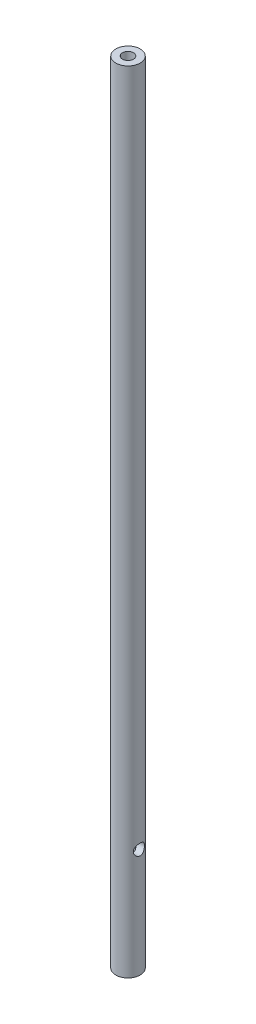
ISO-10303-21;
HEADER;
FILE_DESCRIPTION(('STEP AP214'),'2;1');
FILE_NAME('part.step','',(''),(''),'','','');
FILE_SCHEMA(('AUTOMOTIVE_DESIGN { 1 0 10303 214 1 1 1 1 }'));
ENDSEC;
DATA;
#1=APPLICATION_CONTEXT('core data for automotive mechanical design processes');
#2=APPLICATION_PROTOCOL_DEFINITION('international standard','automotive_design',2000,#1);
#3=PRODUCT_CONTEXT('',#1,'mechanical');
#4=PRODUCT('Part','Part','',(#3));
#5=PRODUCT_RELATED_PRODUCT_CATEGORY('part','',(#4));
#6=PRODUCT_DEFINITION_FORMATION('','',#4);
#7=PRODUCT_DEFINITION_CONTEXT('part definition',#1,'design');
#8=PRODUCT_DEFINITION('design','',#6,#7);
#9=PRODUCT_DEFINITION_SHAPE('','',#8);
#10=(LENGTH_UNIT() NAMED_UNIT(*) SI_UNIT(.MILLI.,.METRE.));
#11=(NAMED_UNIT(*) PLANE_ANGLE_UNIT() SI_UNIT($,.RADIAN.));
#12=(NAMED_UNIT(*) SI_UNIT($,.STERADIAN.) SOLID_ANGLE_UNIT());
#13=UNCERTAINTY_MEASURE_WITH_UNIT(LENGTH_MEASURE(1.E-05),#10,'distance_accuracy_value','');
#14=(GEOMETRIC_REPRESENTATION_CONTEXT(3) GLOBAL_UNCERTAINTY_ASSIGNED_CONTEXT((#13)) GLOBAL_UNIT_ASSIGNED_CONTEXT((#10,
#11,#12)) REPRESENTATION_CONTEXT('',''));
#15=CARTESIAN_POINT('',(0.,0.,0.));
#16=DIRECTION('',(0.,0.,1.));
#17=DIRECTION('',(1.,0.,0.));
#18=AXIS2_PLACEMENT_3D('',#15,#16,#17);
#19=CARTESIAN_POINT('',(0.,177.8,0.));
#20=DIRECTION('',(0.,-1.,0.));
#21=DIRECTION('',(0.,0.,-1.));
#22=AXIS2_PLACEMENT_3D('',#19,#20,#21);
#23=CYLINDRICAL_SURFACE('',#22,5.5);
#24=CARTESIAN_POINT('',(4.89897948556635,-128.8,-2.5));
#25=CARTESIAN_POINT('',(4.89898837136209,-128.667985480388,-2.49999196961874));
#26=CARTESIAN_POINT('',(4.90439430919214,-128.53576098305,-2.48947537601516));
#27=CARTESIAN_POINT('',(4.92528154342172,-128.275234669449,-2.44787943029992));
#28=CARTESIAN_POINT('',(4.94078765324622,-128.146943330807,-2.41674943342954));
#29=CARTESIAN_POINT('',(4.97972515950645,-127.898523098813,-2.33545276721963));
#30=CARTESIAN_POINT('',(5.00312000656303,-127.778359576393,-2.28537376232775));
#31=CARTESIAN_POINT('',(5.05514370332805,-127.548169769196,-2.16786451789088));
#32=CARTESIAN_POINT('',(5.08377199859753,-127.438142412434,-2.10043611605765));
#33=CARTESIAN_POINT('',(5.14541251300063,-127.223105739978,-1.94478481163837));
#34=CARTESIAN_POINT('',(5.17859023757034,-127.118937539058,-1.85546486301863));
#35=CARTESIAN_POINT('',(5.24424327844966,-126.926423448028,-1.66086013546984));
#36=CARTESIAN_POINT('',(5.27671828694639,-126.838084372997,-1.55556851594412));
#37=CARTESIAN_POINT('',(5.33938487776683,-126.675148868167,-1.32512405386514));
#38=CARTESIAN_POINT('',(5.3693621425434,-126.601537305784,-1.19921119992471));
#39=CARTESIAN_POINT('',(5.42157820076016,-126.476915008292,-0.935175493137519));
#40=CARTESIAN_POINT('',(5.44382105010749,-126.425892423736,-0.797059087602486));
#41=CARTESIAN_POINT('',(5.47688079234393,-126.35106566596,-0.521404527396842));
#42=CARTESIAN_POINT('',(5.48830796936361,-126.325800502689,-0.384337720406662));
#43=CARTESIAN_POINT('',(5.5006923336895,-126.298445519358,-0.107467498429943));
#44=CARTESIAN_POINT('',(5.50165463974531,-126.296344368928,0.0323345451249026));
#45=CARTESIAN_POINT('',(5.49333036831599,-126.314698026898,0.299930161709112));
#46=CARTESIAN_POINT('',(5.48477852249735,-126.333535735296,0.427862159653129));
#47=CARTESIAN_POINT('',(5.45944031675457,-126.390407866348,0.678516618532176));
#48=CARTESIAN_POINT('',(5.4426533462381,-126.428443712451,0.8012386924448));
#49=CARTESIAN_POINT('',(5.40210986402921,-126.52302003179,1.04025925182663));
#50=CARTESIAN_POINT('',(5.37825173951429,-126.579831790405,1.15643244507068));
#51=CARTESIAN_POINT('',(5.32582034586311,-126.710045333706,1.37789997312266));
#52=CARTESIAN_POINT('',(5.29724535074113,-126.783453194845,1.48319030268058));
#53=CARTESIAN_POINT('',(5.23541847799083,-126.951699511288,1.68904292536203));
#54=CARTESIAN_POINT('',(5.20197523607053,-127.047797294274,1.78851976078856));
#55=CARTESIAN_POINT('',(5.13581955033586,-127.255234246025,1.97046933056351));
#56=CARTESIAN_POINT('',(5.10310751170601,-127.366581632936,2.05293283580764));
#57=CARTESIAN_POINT('',(5.04059957618345,-127.607619899281,2.20209013788366));
#58=CARTESIAN_POINT('',(5.01100237949505,-127.737912499979,2.26790243596467));
#59=CARTESIAN_POINT('',(4.9605759465359,-128.009420660307,2.37619334831181));
#60=CARTESIAN_POINT('',(4.93973909056794,-128.15062660047,2.41869225029329));
#61=CARTESIAN_POINT('',(4.91119669215877,-128.42905642087,2.47610787476164));
#62=CARTESIAN_POINT('',(4.90264732796546,-128.56582462179,2.49280372821438));
#63=CARTESIAN_POINT('',(4.89722669202924,-128.840446594421,2.50344178002745));
#64=CARTESIAN_POINT('',(4.90034990365081,-128.978299822599,2.49739472702013));
#65=CARTESIAN_POINT('',(4.91703840595107,-129.239136533908,2.46434845386922));
#66=CARTESIAN_POINT('',(4.92972117384158,-129.36240865556,2.43911853242213));
#67=CARTESIAN_POINT('',(4.96289406010737,-129.602815194853,2.3708881040298));
#68=CARTESIAN_POINT('',(4.98338625451043,-129.719947971006,2.32788287150713));
#69=CARTESIAN_POINT('',(5.03098751408293,-129.950730472399,2.2231964595893));
#70=CARTESIAN_POINT('',(5.05835471140892,-130.063980744841,2.16075614493717));
#71=CARTESIAN_POINT('',(5.11631673116395,-130.278999201102,2.01968175448661));
#72=CARTESIAN_POINT('',(5.1469131057585,-130.380761814075,1.94103987364858));
#73=CARTESIAN_POINT('',(5.21158189816562,-130.580562611869,1.76053571539631));
#74=CARTESIAN_POINT('',(5.24569526795824,-130.677204467327,1.65713587652088));
#75=CARTESIAN_POINT('',(5.31079182102949,-130.852098226572,1.43488293637669));
#76=CARTESIAN_POINT('',(5.34177446894746,-130.930346988121,1.31602720003388));
#77=CARTESIAN_POINT('',(5.39763225201338,-131.066794966566,1.06412926866566));
#78=CARTESIAN_POINT('',(5.42243527561898,-131.124760387043,0.930943398080588));
#79=CARTESIAN_POINT('',(5.462596691244,-131.216960912978,0.655271960994651));
#80=CARTESIAN_POINT('',(5.47796188747936,-131.251213116785,0.512793176406642));
#81=CARTESIAN_POINT('',(5.49660137618528,-131.292575179062,0.234932353060238));
#82=CARTESIAN_POINT('',(5.50074734890855,-131.30164338464,0.0998989268588624));
#83=CARTESIAN_POINT('',(5.49903067991948,-131.297868259636,-0.169779714943116));
#84=CARTESIAN_POINT('',(5.49317044733289,-131.285030203274,-0.304425016172095));
#85=CARTESIAN_POINT('',(5.47259382013856,-131.239194431892,-0.562783999730369));
#86=CARTESIAN_POINT('',(5.45831522657028,-131.207192149849,-0.68671234473472));
#87=CARTESIAN_POINT('',(5.42262556787534,-131.125129962004,-0.927328371253363));
#88=CARTESIAN_POINT('',(5.40121329287861,-131.075066992998,-1.04401482055947));
#89=CARTESIAN_POINT('',(5.35204671901927,-130.95580272434,-1.27275603607864));
#90=CARTESIAN_POINT('',(5.32404717038585,-130.885830898662,-1.3843549521877));
#91=CARTESIAN_POINT('',(5.26486798926627,-130.729779173966,-1.59471801782269));
#92=CARTESIAN_POINT('',(5.23368696968894,-130.643692235139,-1.69347652600801));
#93=CARTESIAN_POINT('',(5.16835233718972,-130.449511495473,-1.88390274978156));
#94=CARTESIAN_POINT('',(5.13416609785544,-130.340186674929,-1.9743091440203));
#95=CARTESIAN_POINT('',(5.06911813622376,-130.107094338848,-2.13579923178785));
#96=CARTESIAN_POINT('',(5.03825861331672,-129.98331737984,-2.20687018881923));
#97=CARTESIAN_POINT('',(4.98353191567982,-129.722931552625,-2.32785313471118));
#98=CARTESIAN_POINT('',(4.95972231034886,-129.586228450445,-2.37759232905536));
#99=CARTESIAN_POINT('',(4.93218350800317,-129.375599341251,-2.43392297581613));
#100=CARTESIAN_POINT('',(4.92436998560131,-129.304529209324,-2.4496473475699));
#101=CARTESIAN_POINT('',(4.91174811797804,-129.161045382816,-2.47486081531747));
#102=CARTESIAN_POINT('',(4.90693754299948,-129.088632726331,-2.48435453798031));
#103=CARTESIAN_POINT('',(4.90215466676826,-128.980023480199,-2.49377025102295));
#104=CARTESIAN_POINT('',(4.9009659056619,-128.944070691176,-2.49610476947027));
#105=CARTESIAN_POINT('',(4.89937708775311,-128.872083822645,-2.4992207681039));
#106=CARTESIAN_POINT('',(4.89897705908607,-128.836049740283,-2.50000219288878));
#107=CARTESIAN_POINT('',(4.89897948556635,-128.8,-2.5));
#108=B_SPLINE_CURVE_WITH_KNOTS('',3,(#24,#25,#26,#27,#28,#29,#30,#31,#32,#33,#34,#35,#36,#37,
#38,#39,#40,#41,#42,#43,#44,#45,#46,#47,#48,#49,#50,#51,#52,#53,#54,#55,#56,#57,#58,#59,#60,#61,
#62,#63,#64,#65,#66,#67,#68,#69,#70,#71,#72,#73,#74,#75,#76,#77,#78,#79,#80,#81,#82,#83,#84,#85,
#86,#87,#88,#89,#90,#91,#92,#93,#94,#95,#96,#97,#98,#99,#100,#101,#102,#103,#104,#105,#106,
#107),.UNSPECIFIED.,.T.,.F.,(4,2,2,2,2,2,2,2,2,2,2,2,2,2,2,2,2,2,2,2,2,2,2,2,2,2,2,2,2,2,2,2,2,
2,2,2,2,2,2,2,2,4),(0.,0.395898980290259,0.792774265789117,1.18783548804422,1.58285488117993,
2.00455964210597,2.42644552997631,2.87084384854143,3.31500877310191,3.73227994478338,
4.14934700474926,4.53631095550913,4.92330360200239,5.31615183568052,5.70914413938023,
6.13417892240263,6.55944366838404,7.00393462325152,7.44803815840036,7.85988595707045,
8.27153913487367,8.64923866815495,9.02703867774067,9.42198794151114,9.81712791729529,
10.2518845211396,10.6867153440007,11.1264048228952,11.5657769337786,11.9698739999147,
12.3738737880762,12.7585157617674,13.1432230038509,13.5455235288742,13.9480002087459,
14.3837526843368,14.8197915044243,15.2592985714211,15.4786446804323,15.6978277256036,
15.8059336095569,15.9140433497565),.UNSPECIFIED.);
#109=CARTESIAN_POINT('',(4.89897948556635,-128.8,-2.5));
#110=VERTEX_POINT('',#109);
#111=EDGE_CURVE('E55',#110,#110,#108,.T.);
#112=ORIENTED_EDGE('',*,*,#111,.F.);
#113=EDGE_LOOP('',(#112));
#114=FACE_BOUND('',#113,.T.);
#115=CARTESIAN_POINT('',(0.,177.8,0.));
#116=DIRECTION('',(0.,1.,0.));
#117=DIRECTION('',(0.,0.,1.));
#118=AXIS2_PLACEMENT_3D('',#115,#116,#117);
#119=CIRCLE('',#118,5.5);
#120=CARTESIAN_POINT('',(0.,177.8,5.5));
#121=VERTEX_POINT('',#120);
#122=EDGE_CURVE('E11',#121,#121,#119,.T.);
#123=ORIENTED_EDGE('',*,*,#122,.F.);
#124=EDGE_LOOP('',(#123));
#125=FACE_BOUND('',#124,.T.);
#126=CARTESIAN_POINT('',(0.,-177.8,0.));
#127=DIRECTION('',(0.,1.,0.));
#128=DIRECTION('',(0.,0.,1.));
#129=AXIS2_PLACEMENT_3D('',#126,#127,#128);
#130=CIRCLE('',#129,5.5);
#131=CARTESIAN_POINT('',(0.,-177.8,5.5));
#132=VERTEX_POINT('',#131);
#133=EDGE_CURVE('E36',#132,#132,#130,.T.);
#134=ORIENTED_EDGE('',*,*,#133,.T.);
#135=EDGE_LOOP('',(#134));
#136=FACE_BOUND('',#135,.T.);
#137=ADVANCED_FACE('F33',(#114,#125,#136),#23,.T.);
#138=CARTESIAN_POINT('',(0.,177.8,0.));
#139=DIRECTION('',(0.,1.,0.));
#140=DIRECTION('',(0.,0.,1.));
#141=AXIS2_PLACEMENT_3D('',#138,#139,#140);
#142=PLANE('',#141);
#143=CARTESIAN_POINT('',(0.,177.8,0.));
#144=DIRECTION('',(0.,1.,0.));
#145=DIRECTION('',(0.,0.,1.));
#146=AXIS2_PLACEMENT_3D('',#143,#144,#145);
#147=CIRCLE('',#146,2.5);
#148=CARTESIAN_POINT('',(0.,177.8,2.5));
#149=VERTEX_POINT('',#148);
#150=EDGE_CURVE('E58',#149,#149,#147,.T.);
#151=ORIENTED_EDGE('',*,*,#150,.F.);
#152=EDGE_LOOP('',(#151));
#153=FACE_BOUND('',#152,.T.);
#154=ORIENTED_EDGE('',*,*,#122,.T.);
#155=EDGE_LOOP('',(#154));
#156=FACE_BOUND('',#155,.T.);
#157=ADVANCED_FACE('F73',(#153,#156),#142,.T.);
#158=CARTESIAN_POINT('',(0.,-177.8,0.));
#159=DIRECTION('',(0.,1.,0.));
#160=DIRECTION('',(0.,0.,1.));
#161=AXIS2_PLACEMENT_3D('',#158,#159,#160);
#162=PLANE('',#161);
#163=CARTESIAN_POINT('',(0.,-177.8,0.));
#164=DIRECTION('',(0.,1.,0.));
#165=DIRECTION('',(0.,0.,1.));
#166=AXIS2_PLACEMENT_3D('',#163,#164,#165);
#167=CIRCLE('',#166,2.5);
#168=CARTESIAN_POINT('',(0.,-177.8,2.5));
#169=VERTEX_POINT('',#168);
#170=EDGE_CURVE('E66',#169,#169,#167,.T.);
#171=ORIENTED_EDGE('',*,*,#170,.T.);
#172=EDGE_LOOP('',(#171));
#173=FACE_BOUND('',#172,.T.);
#174=ORIENTED_EDGE('',*,*,#133,.F.);
#175=EDGE_LOOP('',(#174));
#176=FACE_BOUND('',#175,.T.);
#177=ADVANCED_FACE('F76',(#173,#176),#162,.F.);
#178=CARTESIAN_POINT('',(0.,-177.8,0.));
#179=DIRECTION('',(0.,1.,0.));
#180=DIRECTION('',(0.,0.,1.));
#181=AXIS2_PLACEMENT_3D('',#178,#179,#180);
#182=CYLINDRICAL_SURFACE('',#181,2.5);
#183=CARTESIAN_POINT('',(0.,-128.8,0.));
#184=DIRECTION('',(0.707106781186547,-0.707106781186548,0.));
#185=DIRECTION('',(0.707106781186547,0.707106781186548,0.));
#186=AXIS2_PLACEMENT_3D('',#183,#184,#185);
#187=ELLIPSE('',#186,3.53553390593274,2.5);
#188=CARTESIAN_POINT('',(0.,-128.8,2.5));
#189=VERTEX_POINT('',#188);
#190=CARTESIAN_POINT('',(0.,-128.8,-2.5));
#191=VERTEX_POINT('',#190);
#192=EDGE_CURVE('E48',#189,#191,#187,.F.);
#193=ORIENTED_EDGE('',*,*,#192,.F.);
#194=CARTESIAN_POINT('',(0.,-128.8,0.));
#195=DIRECTION('',(0.707106781186547,0.707106781186548,0.));
#196=DIRECTION('',(0.707106781186547,-0.707106781186548,0.));
#197=AXIS2_PLACEMENT_3D('',#194,#195,#196);
#198=ELLIPSE('',#197,3.53553390593274,2.5);
#199=EDGE_CURVE('E46',#191,#189,#198,.F.);
#200=ORIENTED_EDGE('',*,*,#199,.F.);
#201=EDGE_LOOP('',(#193,#200));
#202=FACE_BOUND('',#201,.T.);
#203=ORIENTED_EDGE('',*,*,#170,.F.);
#204=EDGE_LOOP('',(#203));
#205=FACE_BOUND('',#204,.T.);
#206=ORIENTED_EDGE('',*,*,#150,.T.);
#207=EDGE_LOOP('',(#206));
#208=FACE_BOUND('',#207,.T.);
#209=ADVANCED_FACE('F53',(#202,#205,#208),#182,.F.);
#210=CARTESIAN_POINT('',(-5.501,-128.8,0.));
#211=DIRECTION('',(1.,0.,0.));
#212=DIRECTION('',(0.,0.,-1.));
#213=AXIS2_PLACEMENT_3D('',#210,#211,#212);
#214=CYLINDRICAL_SURFACE('',#213,2.5);
#215=ORIENTED_EDGE('',*,*,#199,.T.);
#216=ORIENTED_EDGE('',*,*,#192,.T.);
#217=EDGE_LOOP('',(#215,#216));
#218=FACE_BOUND('',#217,.T.);
#219=ORIENTED_EDGE('',*,*,#111,.T.);
#220=EDGE_LOOP('',(#219));
#221=FACE_BOUND('',#220,.T.);
#222=ADVANCED_FACE('F49',(#218,#221),#214,.F.);
#223=CLOSED_SHELL('',(#137,#157,#177,#209,#222));
#224=MANIFOLD_SOLID_BREP('B2',#223);
#225=ADVANCED_BREP_SHAPE_REPRESENTATION('',(#18,#224),#14);
#226=SHAPE_DEFINITION_REPRESENTATION(#9,#225);
ENDSEC;
END-ISO-10303-21;
